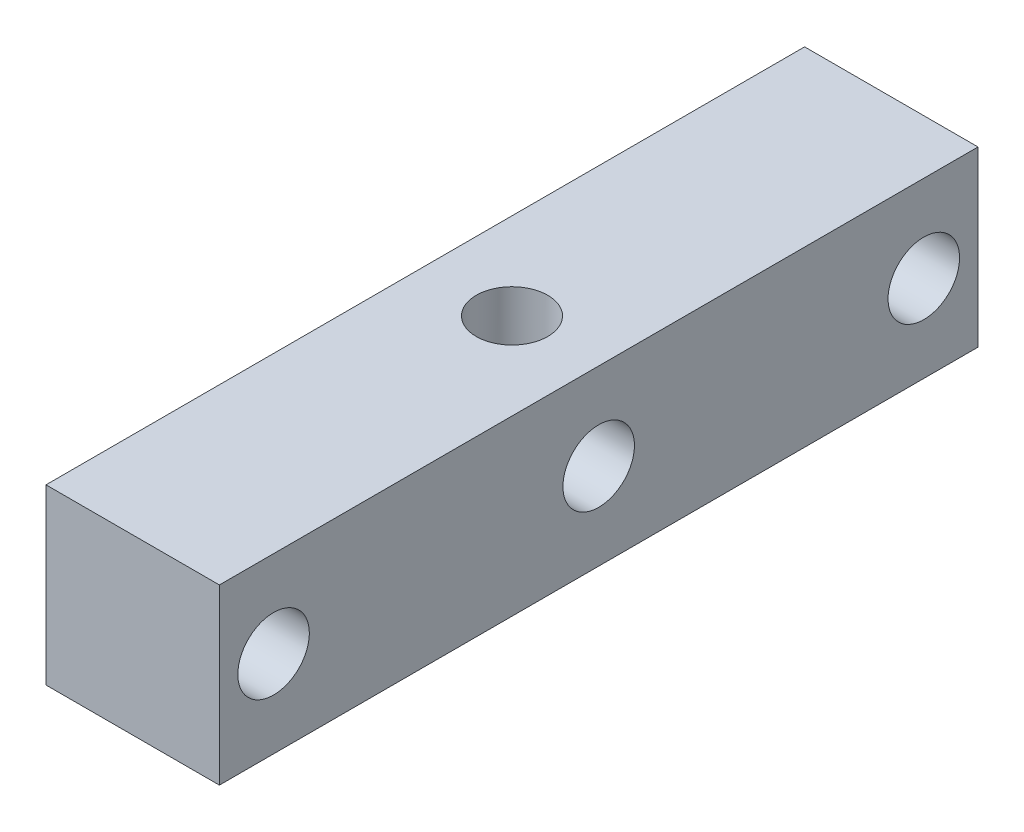
ISO-10303-21;
HEADER;
FILE_DESCRIPTION(('STEP AP214'),'2;1');
FILE_NAME('part.step','',(''),(''),'','','');
FILE_SCHEMA(('AUTOMOTIVE_DESIGN { 1 0 10303 214 1 1 1 1 }'));
ENDSEC;
DATA;
#1=APPLICATION_CONTEXT('core data for automotive mechanical design processes');
#2=APPLICATION_PROTOCOL_DEFINITION('international standard','automotive_design',2000,#1);
#3=PRODUCT_CONTEXT('',#1,'mechanical');
#4=PRODUCT('Part','Part','',(#3));
#5=PRODUCT_RELATED_PRODUCT_CATEGORY('part','',(#4));
#6=PRODUCT_DEFINITION_FORMATION('','',#4);
#7=PRODUCT_DEFINITION_CONTEXT('part definition',#1,'design');
#8=PRODUCT_DEFINITION('design','',#6,#7);
#9=PRODUCT_DEFINITION_SHAPE('','',#8);
#10=(LENGTH_UNIT() NAMED_UNIT(*) SI_UNIT(.MILLI.,.METRE.));
#11=(NAMED_UNIT(*) PLANE_ANGLE_UNIT() SI_UNIT($,.RADIAN.));
#12=(NAMED_UNIT(*) SI_UNIT($,.STERADIAN.) SOLID_ANGLE_UNIT());
#13=UNCERTAINTY_MEASURE_WITH_UNIT(LENGTH_MEASURE(1.E-05),#10,'distance_accuracy_value','');
#14=(GEOMETRIC_REPRESENTATION_CONTEXT(3) GLOBAL_UNCERTAINTY_ASSIGNED_CONTEXT((#13)) GLOBAL_UNIT_ASSIGNED_CONTEXT((#10,
#11,#12)) REPRESENTATION_CONTEXT('',''));
#15=CARTESIAN_POINT('',(0.,0.,0.));
#16=DIRECTION('',(0.,0.,1.));
#17=DIRECTION('',(1.,0.,0.));
#18=AXIS2_PLACEMENT_3D('',#15,#16,#17);
#19=CARTESIAN_POINT('',(8.,0.,35.));
#20=DIRECTION('',(-1.,0.,0.));
#21=DIRECTION('',(0.,-1.,0.));
#22=AXIS2_PLACEMENT_3D('',#19,#20,#21);
#23=PLANE('',#22);
#24=DIRECTION('',(0.,1.,0.));
#25=VECTOR('',#24,1.);
#26=CARTESIAN_POINT('',(8.,0.,0.));
#27=LINE('',#26,#25);
#28=CARTESIAN_POINT('',(8.,0.,0.));
#29=VERTEX_POINT('',#28);
#30=CARTESIAN_POINT('',(8.,8.,0.));
#31=VERTEX_POINT('',#30);
#32=EDGE_CURVE('E119',#29,#31,#27,.T.);
#33=ORIENTED_EDGE('',*,*,#32,.T.);
#34=DIRECTION('',(0.,0.,-1.));
#35=VECTOR('',#34,1.);
#36=CARTESIAN_POINT('',(8.,8.,35.));
#37=LINE('',#36,#35);
#38=CARTESIAN_POINT('',(8.,8.,35.));
#39=VERTEX_POINT('',#38);
#40=EDGE_CURVE('E113',#39,#31,#37,.T.);
#41=ORIENTED_EDGE('',*,*,#40,.F.);
#42=DIRECTION('',(0.,1.,0.));
#43=VECTOR('',#42,1.);
#44=CARTESIAN_POINT('',(8.,0.,35.));
#45=LINE('',#44,#43);
#46=CARTESIAN_POINT('',(8.,0.,35.));
#47=VERTEX_POINT('',#46);
#48=EDGE_CURVE('E128',#47,#39,#45,.T.);
#49=ORIENTED_EDGE('',*,*,#48,.F.);
#50=DIRECTION('',(0.,0.,-1.));
#51=VECTOR('',#50,1.);
#52=CARTESIAN_POINT('',(8.,0.,35.));
#53=LINE('',#52,#51);
#54=EDGE_CURVE('E110',#47,#29,#53,.T.);
#55=ORIENTED_EDGE('',*,*,#54,.T.);
#56=EDGE_LOOP('',(#33,#41,#49,#55));
#57=FACE_BOUND('',#56,.T.);
#58=CARTESIAN_POINT('',(8.,4.,2.5));
#59=DIRECTION('',(1.,0.,0.));
#60=DIRECTION('',(0.,1.,0.));
#61=AXIS2_PLACEMENT_3D('',#58,#59,#60);
#62=CIRCLE('',#61,1.65);
#63=CARTESIAN_POINT('',(8.,5.65,2.5));
#64=VERTEX_POINT('',#63);
#65=EDGE_CURVE('E138',#64,#64,#62,.T.);
#66=ORIENTED_EDGE('',*,*,#65,.F.);
#67=EDGE_LOOP('',(#66));
#68=FACE_BOUND('',#67,.T.);
#69=CARTESIAN_POINT('',(8.,4.,32.5));
#70=DIRECTION('',(1.,0.,0.));
#71=DIRECTION('',(0.,1.,0.));
#72=AXIS2_PLACEMENT_3D('',#69,#70,#71);
#73=CIRCLE('',#72,1.65);
#74=CARTESIAN_POINT('',(8.,5.65,32.5));
#75=VERTEX_POINT('',#74);
#76=EDGE_CURVE('E137',#75,#75,#73,.T.);
#77=ORIENTED_EDGE('',*,*,#76,.F.);
#78=EDGE_LOOP('',(#77));
#79=FACE_BOUND('',#78,.T.);
#80=CARTESIAN_POINT('',(8.,4.,17.5));
#81=DIRECTION('',(1.,0.,0.));
#82=DIRECTION('',(0.,0.,-1.));
#83=AXIS2_PLACEMENT_3D('',#80,#81,#82);
#84=CIRCLE('',#83,1.64999999999999);
#85=CARTESIAN_POINT('',(8.,4.,15.85));
#86=VERTEX_POINT('',#85);
#87=EDGE_CURVE('E152',#86,#86,#84,.T.);
#88=ORIENTED_EDGE('',*,*,#87,.F.);
#89=EDGE_LOOP('',(#88));
#90=FACE_BOUND('',#89,.T.);
#91=ADVANCED_FACE('F39',(#57,#68,#79,#90),#23,.F.);
#92=CARTESIAN_POINT('',(4.,-32.,17.5));
#93=DIRECTION('',(0.,1.,0.));
#94=DIRECTION('',(0.,0.,1.));
#95=AXIS2_PLACEMENT_3D('',#92,#93,#94);
#96=CYLINDRICAL_SURFACE('',#95,1.65);
#97=CARTESIAN_POINT('',(4.,8.,17.5));
#98=DIRECTION('',(0.,1.,0.));
#99=DIRECTION('',(0.,0.,1.));
#100=AXIS2_PLACEMENT_3D('',#97,#98,#99);
#101=CIRCLE('',#100,1.65);
#102=CARTESIAN_POINT('',(4.,8.,19.15));
#103=VERTEX_POINT('',#102);
#104=EDGE_CURVE('E146',#103,#103,#101,.T.);
#105=ORIENTED_EDGE('',*,*,#104,.T.);
#106=EDGE_LOOP('',(#105));
#107=FACE_BOUND('',#106,.T.);
#108=CARTESIAN_POINT('',(4.,4.,17.5));
#109=DIRECTION('',(-0.707106781186547,0.707106781186547,0.));
#110=DIRECTION('',(0.707106781186547,0.707106781186547,0.));
#111=AXIS2_PLACEMENT_3D('',#108,#109,#110);
#112=ELLIPSE('',#111,2.3334523779156,1.65);
#113=CARTESIAN_POINT('',(4.,4.,15.85));
#114=VERTEX_POINT('',#113);
#115=CARTESIAN_POINT('',(4.,4.,19.15));
#116=VERTEX_POINT('',#115);
#117=EDGE_CURVE('E52',#114,#116,#112,.F.);
#118=ORIENTED_EDGE('',*,*,#117,.T.);
#119=CARTESIAN_POINT('',(4.,4.,17.5));
#120=DIRECTION('',(0.707106781186547,0.707106781186547,0.));
#121=DIRECTION('',(-0.707106781186547,0.707106781186547,0.));
#122=AXIS2_PLACEMENT_3D('',#119,#120,#121);
#123=ELLIPSE('',#122,2.3334523779156,1.65);
#124=EDGE_CURVE('E11',#116,#114,#123,.F.);
#125=ORIENTED_EDGE('',*,*,#124,.T.);
#126=EDGE_LOOP('',(#118,#125));
#127=FACE_BOUND('',#126,.T.);
#128=ADVANCED_FACE('F105',(#107,#127),#96,.F.);
#129=CARTESIAN_POINT('',(0.,0.,35.));
#130=DIRECTION('',(1.,0.,0.));
#131=DIRECTION('',(0.,0.,-1.));
#132=AXIS2_PLACEMENT_3D('',#129,#130,#131);
#133=PLANE('',#132);
#134=CARTESIAN_POINT('',(0.,4.,17.5));
#135=DIRECTION('',(1.,0.,0.));
#136=DIRECTION('',(0.,0.,-1.));
#137=AXIS2_PLACEMENT_3D('',#134,#135,#136);
#138=CIRCLE('',#137,1.65);
#139=CARTESIAN_POINT('',(0.,4.,15.85));
#140=VERTEX_POINT('',#139);
#141=EDGE_CURVE('E149',#140,#140,#138,.T.);
#142=ORIENTED_EDGE('',*,*,#141,.T.);
#143=EDGE_LOOP('',(#142));
#144=FACE_BOUND('',#143,.T.);
#145=CARTESIAN_POINT('',(0.,4.,32.5));
#146=DIRECTION('',(1.,0.,0.));
#147=DIRECTION('',(0.,0.,-1.));
#148=AXIS2_PLACEMENT_3D('',#145,#146,#147);
#149=CIRCLE('',#148,1.65);
#150=CARTESIAN_POINT('',(0.,4.,30.85));
#151=VERTEX_POINT('',#150);
#152=EDGE_CURVE('E126',#151,#151,#149,.T.);
#153=ORIENTED_EDGE('',*,*,#152,.T.);
#154=EDGE_LOOP('',(#153));
#155=FACE_BOUND('',#154,.T.);
#156=CARTESIAN_POINT('',(0.,4.,2.5));
#157=DIRECTION('',(1.,0.,0.));
#158=DIRECTION('',(0.,0.,-1.));
#159=AXIS2_PLACEMENT_3D('',#156,#157,#158);
#160=CIRCLE('',#159,1.65);
#161=CARTESIAN_POINT('',(0.,4.,0.850000000000002));
#162=VERTEX_POINT('',#161);
#163=EDGE_CURVE('E134',#162,#162,#160,.T.);
#164=ORIENTED_EDGE('',*,*,#163,.T.);
#165=EDGE_LOOP('',(#164));
#166=FACE_BOUND('',#165,.T.);
#167=DIRECTION('',(0.,-1.,0.));
#168=VECTOR('',#167,1.);
#169=CARTESIAN_POINT('',(0.,0.,0.));
#170=LINE('',#169,#168);
#171=CARTESIAN_POINT('',(0.,8.,0.));
#172=VERTEX_POINT('',#171);
#173=CARTESIAN_POINT('',(0.,0.,0.));
#174=VERTEX_POINT('',#173);
#175=EDGE_CURVE('E123',#172,#174,#170,.T.);
#176=ORIENTED_EDGE('',*,*,#175,.T.);
#177=DIRECTION('',(0.,0.,-1.));
#178=VECTOR('',#177,1.);
#179=CARTESIAN_POINT('',(0.,0.,35.));
#180=LINE('',#179,#178);
#181=CARTESIAN_POINT('',(0.,0.,35.));
#182=VERTEX_POINT('',#181);
#183=EDGE_CURVE('E103',#182,#174,#180,.T.);
#184=ORIENTED_EDGE('',*,*,#183,.F.);
#185=DIRECTION('',(0.,-1.,0.));
#186=VECTOR('',#185,1.);
#187=CARTESIAN_POINT('',(0.,0.,35.));
#188=LINE('',#187,#186);
#189=CARTESIAN_POINT('',(0.,8.,35.));
#190=VERTEX_POINT('',#189);
#191=EDGE_CURVE('E118',#190,#182,#188,.T.);
#192=ORIENTED_EDGE('',*,*,#191,.F.);
#193=DIRECTION('',(0.,0.,-1.));
#194=VECTOR('',#193,1.);
#195=CARTESIAN_POINT('',(0.,8.,35.));
#196=LINE('',#195,#194);
#197=EDGE_CURVE('E115',#190,#172,#196,.T.);
#198=ORIENTED_EDGE('',*,*,#197,.T.);
#199=EDGE_LOOP('',(#176,#184,#192,#198));
#200=FACE_BOUND('',#199,.T.);
#201=ADVANCED_FACE('F41',(#144,#155,#166,#200),#133,.F.);
#202=CARTESIAN_POINT('',(0.,0.,35.));
#203=DIRECTION('',(0.,1.,0.));
#204=DIRECTION('',(0.,0.,1.));
#205=AXIS2_PLACEMENT_3D('',#202,#203,#204);
#206=PLANE('',#205);
#207=CARTESIAN_POINT('',(4.,0.,17.5));
#208=DIRECTION('',(0.,1.,0.));
#209=DIRECTION('',(0.,0.,1.));
#210=AXIS2_PLACEMENT_3D('',#207,#208,#209);
#211=CIRCLE('',#210,1.65);
#212=CARTESIAN_POINT('',(4.,0.,19.15));
#213=VERTEX_POINT('',#212);
#214=EDGE_CURVE('E141',#213,#213,#211,.T.);
#215=ORIENTED_EDGE('',*,*,#214,.T.);
#216=EDGE_LOOP('',(#215));
#217=FACE_BOUND('',#216,.T.);
#218=DIRECTION('',(1.,0.,0.));
#219=VECTOR('',#218,1.);
#220=CARTESIAN_POINT('',(0.,0.,0.));
#221=LINE('',#220,#219);
#222=EDGE_CURVE('E121',#174,#29,#221,.T.);
#223=ORIENTED_EDGE('',*,*,#222,.T.);
#224=ORIENTED_EDGE('',*,*,#54,.F.);
#225=DIRECTION('',(1.,0.,0.));
#226=VECTOR('',#225,1.);
#227=CARTESIAN_POINT('',(0.,0.,35.));
#228=LINE('',#227,#226);
#229=EDGE_CURVE('E90',#182,#47,#228,.T.);
#230=ORIENTED_EDGE('',*,*,#229,.F.);
#231=ORIENTED_EDGE('',*,*,#183,.T.);
#232=EDGE_LOOP('',(#223,#224,#230,#231));
#233=FACE_BOUND('',#232,.T.);
#234=ADVANCED_FACE('F171',(#217,#233),#206,.F.);
#235=CARTESIAN_POINT('',(0.,8.,35.));
#236=DIRECTION('',(0.,-1.,0.));
#237=DIRECTION('',(0.,0.,-1.));
#238=AXIS2_PLACEMENT_3D('',#235,#236,#237);
#239=PLANE('',#238);
#240=ORIENTED_EDGE('',*,*,#104,.F.);
#241=EDGE_LOOP('',(#240));
#242=FACE_BOUND('',#241,.T.);
#243=DIRECTION('',(-1.,0.,0.));
#244=VECTOR('',#243,1.);
#245=CARTESIAN_POINT('',(0.,8.,0.));
#246=LINE('',#245,#244);
#247=EDGE_CURVE('E82',#31,#172,#246,.T.);
#248=ORIENTED_EDGE('',*,*,#247,.T.);
#249=ORIENTED_EDGE('',*,*,#197,.F.);
#250=DIRECTION('',(-1.,0.,0.));
#251=VECTOR('',#250,1.);
#252=CARTESIAN_POINT('',(0.,8.,35.));
#253=LINE('',#252,#251);
#254=EDGE_CURVE('E61',#39,#190,#253,.T.);
#255=ORIENTED_EDGE('',*,*,#254,.F.);
#256=ORIENTED_EDGE('',*,*,#40,.T.);
#257=EDGE_LOOP('',(#248,#249,#255,#256));
#258=FACE_BOUND('',#257,.T.);
#259=ADVANCED_FACE('F169',(#242,#258),#239,.F.);
#260=CARTESIAN_POINT('',(0.,0.,35.));
#261=DIRECTION('',(0.,0.,-1.));
#262=DIRECTION('',(-1.,0.,0.));
#263=AXIS2_PLACEMENT_3D('',#260,#261,#262);
#264=PLANE('',#263);
#265=ORIENTED_EDGE('',*,*,#191,.T.);
#266=ORIENTED_EDGE('',*,*,#229,.T.);
#267=ORIENTED_EDGE('',*,*,#48,.T.);
#268=ORIENTED_EDGE('',*,*,#254,.T.);
#269=EDGE_LOOP('',(#265,#266,#267,#268));
#270=FACE_BOUND('',#269,.T.);
#271=ADVANCED_FACE('F178',(#270),#264,.F.);
#272=CARTESIAN_POINT('',(0.,0.,0.));
#273=DIRECTION('',(0.,0.,-1.));
#274=DIRECTION('',(-1.,0.,0.));
#275=AXIS2_PLACEMENT_3D('',#272,#273,#274);
#276=PLANE('',#275);
#277=ORIENTED_EDGE('',*,*,#175,.F.);
#278=ORIENTED_EDGE('',*,*,#247,.F.);
#279=ORIENTED_EDGE('',*,*,#32,.F.);
#280=ORIENTED_EDGE('',*,*,#222,.F.);
#281=EDGE_LOOP('',(#277,#278,#279,#280));
#282=FACE_BOUND('',#281,.T.);
#283=ADVANCED_FACE('F189',(#282),#276,.T.);
#284=CARTESIAN_POINT('',(-32.,3.99999999999999,2.5));
#285=DIRECTION('',(1.,0.,0.));
#286=DIRECTION('',(0.,1.,0.));
#287=AXIS2_PLACEMENT_3D('',#284,#285,#286);
#288=CYLINDRICAL_SURFACE('',#287,1.65);
#289=ORIENTED_EDGE('',*,*,#65,.T.);
#290=EDGE_LOOP('',(#289));
#291=FACE_BOUND('',#290,.T.);
#292=ORIENTED_EDGE('',*,*,#163,.F.);
#293=EDGE_LOOP('',(#292));
#294=FACE_BOUND('',#293,.T.);
#295=ADVANCED_FACE('F197',(#291,#294),#288,.F.);
#296=CARTESIAN_POINT('',(-32.,3.99999999999999,32.5));
#297=DIRECTION('',(1.,0.,0.));
#298=DIRECTION('',(0.,1.,0.));
#299=AXIS2_PLACEMENT_3D('',#296,#297,#298);
#300=CYLINDRICAL_SURFACE('',#299,1.65);
#301=ORIENTED_EDGE('',*,*,#76,.T.);
#302=EDGE_LOOP('',(#301));
#303=FACE_BOUND('',#302,.T.);
#304=ORIENTED_EDGE('',*,*,#152,.F.);
#305=EDGE_LOOP('',(#304));
#306=FACE_BOUND('',#305,.T.);
#307=ADVANCED_FACE('F201',(#303,#306),#300,.F.);
#308=CARTESIAN_POINT('',(4.,4.,17.5));
#309=DIRECTION('',(-0.707106781186547,0.707106781186547,0.));
#310=DIRECTION('',(0.707106781186547,0.707106781186547,0.));
#311=AXIS2_PLACEMENT_3D('',#308,#309,#310);
#312=ELLIPSE('',#311,2.3334523779156,1.65);
#313=EDGE_CURVE('E96',#114,#116,#312,.T.);
#314=ORIENTED_EDGE('',*,*,#313,.T.);
#315=CARTESIAN_POINT('',(4.,4.,17.5));
#316=DIRECTION('',(0.707106781186547,0.707106781186547,0.));
#317=DIRECTION('',(-0.707106781186547,0.707106781186547,0.));
#318=AXIS2_PLACEMENT_3D('',#315,#316,#317);
#319=ELLIPSE('',#318,2.3334523779156,1.65);
#320=EDGE_CURVE('E47',#116,#114,#319,.T.);
#321=ORIENTED_EDGE('',*,*,#320,.T.);
#322=EDGE_LOOP('',(#314,#321));
#323=FACE_BOUND('',#322,.T.);
#324=ORIENTED_EDGE('',*,*,#214,.F.);
#325=EDGE_LOOP('',(#324));
#326=FACE_BOUND('',#325,.T.);
#327=ADVANCED_FACE('F106',(#323,#326),#96,.F.);
#328=CARTESIAN_POINT('',(8.,4.,17.5));
#329=DIRECTION('',(1.,0.,0.));
#330=DIRECTION('',(0.,0.,-1.));
#331=AXIS2_PLACEMENT_3D('',#328,#329,#330);
#332=CYLINDRICAL_SURFACE('',#331,1.64999999999999);
#333=ORIENTED_EDGE('',*,*,#87,.T.);
#334=EDGE_LOOP('',(#333));
#335=FACE_BOUND('',#334,.T.);
#336=ORIENTED_EDGE('',*,*,#117,.F.);
#337=ORIENTED_EDGE('',*,*,#320,.F.);
#338=EDGE_LOOP('',(#336,#337));
#339=FACE_BOUND('',#338,.T.);
#340=ADVANCED_FACE('F102',(#335,#339),#332,.F.);
#341=ORIENTED_EDGE('',*,*,#141,.F.);
#342=EDGE_LOOP('',(#341));
#343=FACE_BOUND('',#342,.T.);
#344=ORIENTED_EDGE('',*,*,#313,.F.);
#345=ORIENTED_EDGE('',*,*,#124,.F.);
#346=EDGE_LOOP('',(#344,#345));
#347=FACE_BOUND('',#346,.T.);
#348=ADVANCED_FACE('F97',(#343,#347),#332,.F.);
#349=CLOSED_SHELL('',(#91,#128,#201,#234,#259,#271,#283,#295,#307,#327,#340,#348));
#350=MANIFOLD_SOLID_BREP('B2',#349);
#351=ADVANCED_BREP_SHAPE_REPRESENTATION('',(#18,#350),#14);
#352=SHAPE_DEFINITION_REPRESENTATION(#9,#351);
ENDSEC;
END-ISO-10303-21;
